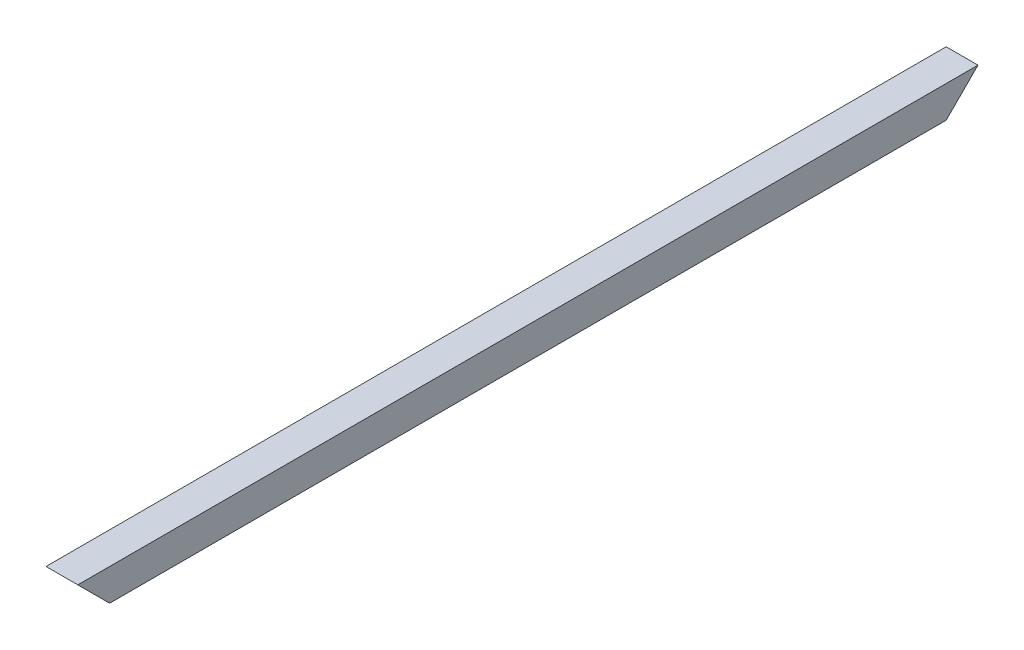
ISO-10303-21;
HEADER;
FILE_DESCRIPTION(('STEP AP214'),'2;1');
FILE_NAME('part.step','',(''),(''),'','','');
FILE_SCHEMA(('AUTOMOTIVE_DESIGN { 1 0 10303 214 1 1 1 1 }'));
ENDSEC;
DATA;
#1=APPLICATION_CONTEXT('core data for automotive mechanical design processes');
#2=APPLICATION_PROTOCOL_DEFINITION('international standard','automotive_design',2000,#1);
#3=PRODUCT_CONTEXT('',#1,'mechanical');
#4=PRODUCT('Part','Part','',(#3));
#5=PRODUCT_RELATED_PRODUCT_CATEGORY('part','',(#4));
#6=PRODUCT_DEFINITION_FORMATION('','',#4);
#7=PRODUCT_DEFINITION_CONTEXT('part definition',#1,'design');
#8=PRODUCT_DEFINITION('design','',#6,#7);
#9=PRODUCT_DEFINITION_SHAPE('','',#8);
#10=(LENGTH_UNIT() NAMED_UNIT(*) SI_UNIT(.MILLI.,.METRE.));
#11=(NAMED_UNIT(*) PLANE_ANGLE_UNIT() SI_UNIT($,.RADIAN.));
#12=(NAMED_UNIT(*) SI_UNIT($,.STERADIAN.) SOLID_ANGLE_UNIT());
#13=UNCERTAINTY_MEASURE_WITH_UNIT(LENGTH_MEASURE(1.E-05),#10,'distance_accuracy_value','');
#14=(GEOMETRIC_REPRESENTATION_CONTEXT(3) GLOBAL_UNCERTAINTY_ASSIGNED_CONTEXT((#13)) GLOBAL_UNIT_ASSIGNED_CONTEXT((#10,
#11,#12)) REPRESENTATION_CONTEXT('',''));
#15=CARTESIAN_POINT('',(0.,0.,0.));
#16=DIRECTION('',(0.,0.,1.));
#17=DIRECTION('',(1.,0.,0.));
#18=AXIS2_PLACEMENT_3D('',#15,#16,#17);
#19=CARTESIAN_POINT('',(-23.,-23.,1414.3));
#20=DIRECTION('',(0.,1.,0.));
#21=DIRECTION('',(0.,0.,1.));
#22=AXIS2_PLACEMENT_3D('',#19,#20,#21);
#23=PLANE('',#22);
#24=DIRECTION('',(-1.,0.,0.));
#25=VECTOR('',#24,1.);
#26=CARTESIAN_POINT('',(-23.,-23.,1366.3));
#27=LINE('',#26,#25);
#28=CARTESIAN_POINT('',(23.,-23.,1366.3));
#29=VERTEX_POINT('',#28);
#30=CARTESIAN_POINT('',(-23.,-23.,1366.3));
#31=VERTEX_POINT('',#30);
#32=EDGE_CURVE('E11',#29,#31,#27,.T.);
#33=ORIENTED_EDGE('',*,*,#32,.F.);
#34=DIRECTION('',(0.,0.,-1.));
#35=VECTOR('',#34,1.);
#36=CARTESIAN_POINT('',(23.,-23.,1414.3));
#37=LINE('',#36,#35);
#38=CARTESIAN_POINT('',(23.,-23.,48.));
#39=VERTEX_POINT('',#38);
#40=EDGE_CURVE('E153',#29,#39,#37,.T.);
#41=ORIENTED_EDGE('',*,*,#40,.T.);
#42=DIRECTION('',(1.,0.,0.));
#43=VECTOR('',#42,1.);
#44=CARTESIAN_POINT('',(-23.,-23.,48.));
#45=LINE('',#44,#43);
#46=CARTESIAN_POINT('',(-23.,-23.,48.));
#47=VERTEX_POINT('',#46);
#48=EDGE_CURVE('E48',#47,#39,#45,.T.);
#49=ORIENTED_EDGE('',*,*,#48,.F.);
#50=DIRECTION('',(0.,0.,-1.));
#51=VECTOR('',#50,1.);
#52=CARTESIAN_POINT('',(-23.,-23.,1414.3));
#53=LINE('',#52,#51);
#54=EDGE_CURVE('E162',#31,#47,#53,.T.);
#55=ORIENTED_EDGE('',*,*,#54,.F.);
#56=EDGE_LOOP('',(#33,#41,#49,#55));
#57=FACE_BOUND('',#56,.T.);
#58=ADVANCED_FACE('F39',(#57),#23,.T.);
#59=CARTESIAN_POINT('',(-23.,-23.,1414.3));
#60=DIRECTION('',(1.,0.,0.));
#61=DIRECTION('',(0.,0.,-1.));
#62=AXIS2_PLACEMENT_3D('',#59,#60,#61);
#63=PLANE('',#62);
#64=DIRECTION('',(0.,0.707106781186547,0.707106781186548));
#65=VECTOR('',#64,1.);
#66=CARTESIAN_POINT('',(-23.,1.00000000000003,1390.3));
#67=LINE('',#66,#65);
#68=CARTESIAN_POINT('',(-23.,23.,1412.3));
#69=VERTEX_POINT('',#68);
#70=EDGE_CURVE('E157',#31,#69,#67,.T.);
#71=ORIENTED_EDGE('',*,*,#70,.F.);
#72=ORIENTED_EDGE('',*,*,#54,.T.);
#73=DIRECTION('',(0.,-0.707106781186548,0.707106781186548));
#74=VECTOR('',#73,1.);
#75=CARTESIAN_POINT('',(-23.,-706.15,731.15));
#76=LINE('',#75,#74);
#77=CARTESIAN_POINT('',(-23.,22.9999999999999,2.00000000000011));
#78=VERTEX_POINT('',#77);
#79=EDGE_CURVE('E143',#78,#47,#76,.T.);
#80=ORIENTED_EDGE('',*,*,#79,.F.);
#81=DIRECTION('',(0.,0.,-1.));
#82=VECTOR('',#81,1.);
#83=CARTESIAN_POINT('',(-23.,23.,1414.3));
#84=LINE('',#83,#82);
#85=EDGE_CURVE('E167',#69,#78,#84,.T.);
#86=ORIENTED_EDGE('',*,*,#85,.F.);
#87=EDGE_LOOP('',(#71,#72,#80,#86));
#88=FACE_BOUND('',#87,.T.);
#89=ADVANCED_FACE('F208',(#88),#63,.T.);
#90=CARTESIAN_POINT('',(-23.,23.,1414.3));
#91=DIRECTION('',(0.,-1.,0.));
#92=DIRECTION('',(1.,0.,0.));
#93=AXIS2_PLACEMENT_3D('',#90,#91,#92);
#94=PLANE('',#93);
#95=DIRECTION('',(1.,0.,0.));
#96=VECTOR('',#95,1.);
#97=CARTESIAN_POINT('',(-23.,23.,1412.3));
#98=LINE('',#97,#96);
#99=CARTESIAN_POINT('',(23.,23.,1412.3));
#100=VERTEX_POINT('',#99);
#101=EDGE_CURVE('E169',#69,#100,#98,.T.);
#102=ORIENTED_EDGE('',*,*,#101,.F.);
#103=ORIENTED_EDGE('',*,*,#85,.T.);
#104=DIRECTION('',(-1.,0.,0.));
#105=VECTOR('',#104,1.);
#106=CARTESIAN_POINT('',(-23.0000000000001,23.,2.));
#107=LINE('',#106,#105);
#108=CARTESIAN_POINT('',(23.,23.,2.));
#109=VERTEX_POINT('',#108);
#110=EDGE_CURVE('E158',#109,#78,#107,.T.);
#111=ORIENTED_EDGE('',*,*,#110,.F.);
#112=DIRECTION('',(0.,0.,-1.));
#113=VECTOR('',#112,1.);
#114=CARTESIAN_POINT('',(23.,23.,1414.3));
#115=LINE('',#114,#113);
#116=EDGE_CURVE('E155',#100,#109,#115,.T.);
#117=ORIENTED_EDGE('',*,*,#116,.F.);
#118=EDGE_LOOP('',(#102,#103,#111,#117));
#119=FACE_BOUND('',#118,.T.);
#120=ADVANCED_FACE('F206',(#119),#94,.T.);
#121=CARTESIAN_POINT('',(23.,-23.,1414.3));
#122=DIRECTION('',(-1.,0.,0.));
#123=DIRECTION('',(0.,-1.,0.));
#124=AXIS2_PLACEMENT_3D('',#121,#122,#123);
#125=PLANE('',#124);
#126=DIRECTION('',(0.,-0.707106781186547,-0.707106781186548));
#127=VECTOR('',#126,1.);
#128=CARTESIAN_POINT('',(23.,1.00000000000003,1390.3));
#129=LINE('',#128,#127);
#130=EDGE_CURVE('E163',#100,#29,#129,.T.);
#131=ORIENTED_EDGE('',*,*,#130,.F.);
#132=ORIENTED_EDGE('',*,*,#116,.T.);
#133=DIRECTION('',(0.,0.707106781186548,-0.707106781186548));
#134=VECTOR('',#133,1.);
#135=CARTESIAN_POINT('',(23.0000000000001,-706.15,731.15));
#136=LINE('',#135,#134);
#137=EDGE_CURVE('E140',#39,#109,#136,.T.);
#138=ORIENTED_EDGE('',*,*,#137,.F.);
#139=ORIENTED_EDGE('',*,*,#40,.F.);
#140=EDGE_LOOP('',(#131,#132,#138,#139));
#141=FACE_BOUND('',#140,.T.);
#142=ADVANCED_FACE('F152',(#141),#125,.T.);
#143=CARTESIAN_POINT('',(-25.,-25.,50.));
#144=DIRECTION('',(0.,0.707106781186547,0.707106781186547));
#145=DIRECTION('',(0.,-0.707106781186548,0.707106781186548));
#146=AXIS2_PLACEMENT_3D('',#143,#144,#145);
#147=PLANE('',#146);
#148=ORIENTED_EDGE('',*,*,#137,.T.);
#149=ORIENTED_EDGE('',*,*,#110,.T.);
#150=ORIENTED_EDGE('',*,*,#79,.T.);
#151=ORIENTED_EDGE('',*,*,#48,.T.);
#152=EDGE_LOOP('',(#148,#149,#150,#151));
#153=FACE_BOUND('',#152,.T.);
#154=DIRECTION('',(0.,-0.707106781186547,0.707106781186547));
#155=VECTOR('',#154,1.);
#156=CARTESIAN_POINT('',(25.,-25.,50.));
#157=LINE('',#156,#155);
#158=CARTESIAN_POINT('',(25.,25.,0.));
#159=VERTEX_POINT('',#158);
#160=CARTESIAN_POINT('',(25.,-25.,50.));
#161=VERTEX_POINT('',#160);
#162=EDGE_CURVE('E63',#159,#161,#157,.T.);
#163=ORIENTED_EDGE('',*,*,#162,.T.);
#164=DIRECTION('',(1.,0.,0.));
#165=VECTOR('',#164,1.);
#166=CARTESIAN_POINT('',(-25.,-25.,50.));
#167=LINE('',#166,#165);
#168=CARTESIAN_POINT('',(-25.,-25.,50.));
#169=VERTEX_POINT('',#168);
#170=EDGE_CURVE('E185',#169,#161,#167,.T.);
#171=ORIENTED_EDGE('',*,*,#170,.F.);
#172=DIRECTION('',(0.,-0.707106781186547,0.707106781186547));
#173=VECTOR('',#172,1.);
#174=CARTESIAN_POINT('',(-25.,-25.,50.));
#175=LINE('',#174,#173);
#176=CARTESIAN_POINT('',(-25.,25.,0.));
#177=VERTEX_POINT('',#176);
#178=EDGE_CURVE('E187',#177,#169,#175,.T.);
#179=ORIENTED_EDGE('',*,*,#178,.F.);
#180=DIRECTION('',(-1.,0.,0.));
#181=VECTOR('',#180,1.);
#182=CARTESIAN_POINT('',(-25.,25.,0.));
#183=LINE('',#182,#181);
#184=EDGE_CURVE('E112',#159,#177,#183,.T.);
#185=ORIENTED_EDGE('',*,*,#184,.F.);
#186=EDGE_LOOP('',(#163,#171,#179,#185));
#187=FACE_BOUND('',#186,.T.);
#188=ADVANCED_FACE('F139',(#153,#187),#147,.F.);
#189=CARTESIAN_POINT('',(-25.,-25.,1364.3));
#190=DIRECTION('',(0.,0.707106781186548,-0.707106781186547));
#191=DIRECTION('',(0.,0.707106781186547,0.707106781186548));
#192=AXIS2_PLACEMENT_3D('',#189,#190,#191);
#193=PLANE('',#192);
#194=ORIENTED_EDGE('',*,*,#130,.T.);
#195=ORIENTED_EDGE('',*,*,#32,.T.);
#196=ORIENTED_EDGE('',*,*,#70,.T.);
#197=ORIENTED_EDGE('',*,*,#101,.T.);
#198=EDGE_LOOP('',(#194,#195,#196,#197));
#199=FACE_BOUND('',#198,.T.);
#200=DIRECTION('',(0.,0.707106781186547,0.707106781186548));
#201=VECTOR('',#200,1.);
#202=CARTESIAN_POINT('',(25.,-25.,1364.3));
#203=LINE('',#202,#201);
#204=CARTESIAN_POINT('',(25.,-25.,1364.3));
#205=VERTEX_POINT('',#204);
#206=CARTESIAN_POINT('',(25.,25.,1414.3));
#207=VERTEX_POINT('',#206);
#208=EDGE_CURVE('E105',#205,#207,#203,.T.);
#209=ORIENTED_EDGE('',*,*,#208,.T.);
#210=DIRECTION('',(-1.,0.,0.));
#211=VECTOR('',#210,1.);
#212=CARTESIAN_POINT('',(-25.,25.,1414.3));
#213=LINE('',#212,#211);
#214=CARTESIAN_POINT('',(-25.,25.,1414.3));
#215=VERTEX_POINT('',#214);
#216=EDGE_CURVE('E102',#207,#215,#213,.T.);
#217=ORIENTED_EDGE('',*,*,#216,.T.);
#218=DIRECTION('',(0.,0.707106781186547,0.707106781186548));
#219=VECTOR('',#218,1.);
#220=CARTESIAN_POINT('',(-25.,-25.,1364.3));
#221=LINE('',#220,#219);
#222=CARTESIAN_POINT('',(-25.,-25.,1364.3));
#223=VERTEX_POINT('',#222);
#224=EDGE_CURVE('E55',#223,#215,#221,.T.);
#225=ORIENTED_EDGE('',*,*,#224,.F.);
#226=DIRECTION('',(1.,0.,0.));
#227=VECTOR('',#226,1.);
#228=CARTESIAN_POINT('',(-25.,-25.,1364.3));
#229=LINE('',#228,#227);
#230=EDGE_CURVE('E123',#223,#205,#229,.T.);
#231=ORIENTED_EDGE('',*,*,#230,.T.);
#232=EDGE_LOOP('',(#209,#217,#225,#231));
#233=FACE_BOUND('',#232,.T.);
#234=ADVANCED_FACE('F103',(#199,#233),#193,.F.);
#235=CARTESIAN_POINT('',(25.,-25.,1414.3));
#236=DIRECTION('',(-1.,0.,0.));
#237=DIRECTION('',(0.,0.,1.));
#238=AXIS2_PLACEMENT_3D('',#235,#236,#237);
#239=PLANE('',#238);
#240=DIRECTION('',(0.,0.,-1.));
#241=VECTOR('',#240,1.);
#242=CARTESIAN_POINT('',(25.,25.,1414.3));
#243=LINE('',#242,#241);
#244=EDGE_CURVE('E128',#207,#159,#243,.T.);
#245=ORIENTED_EDGE('',*,*,#244,.F.);
#246=ORIENTED_EDGE('',*,*,#208,.F.);
#247=DIRECTION('',(0.,0.,-1.));
#248=VECTOR('',#247,1.);
#249=CARTESIAN_POINT('',(25.,-25.,1414.3));
#250=LINE('',#249,#248);
#251=EDGE_CURVE('E111',#205,#161,#250,.T.);
#252=ORIENTED_EDGE('',*,*,#251,.T.);
#253=ORIENTED_EDGE('',*,*,#162,.F.);
#254=EDGE_LOOP('',(#245,#246,#252,#253));
#255=FACE_BOUND('',#254,.T.);
#256=ADVANCED_FACE('F41',(#255),#239,.F.);
#257=CARTESIAN_POINT('',(-25.,25.,1414.3));
#258=DIRECTION('',(0.,-1.,0.));
#259=DIRECTION('',(0.,0.,-1.));
#260=AXIS2_PLACEMENT_3D('',#257,#258,#259);
#261=PLANE('',#260);
#262=ORIENTED_EDGE('',*,*,#184,.T.);
#263=DIRECTION('',(0.,0.,-1.));
#264=VECTOR('',#263,1.);
#265=CARTESIAN_POINT('',(-25.,25.,1414.3));
#266=LINE('',#265,#264);
#267=EDGE_CURVE('E119',#215,#177,#266,.T.);
#268=ORIENTED_EDGE('',*,*,#267,.F.);
#269=ORIENTED_EDGE('',*,*,#216,.F.);
#270=ORIENTED_EDGE('',*,*,#244,.T.);
#271=EDGE_LOOP('',(#262,#268,#269,#270));
#272=FACE_BOUND('',#271,.T.);
#273=ADVANCED_FACE('F126',(#272),#261,.F.);
#274=CARTESIAN_POINT('',(-25.,-25.,1414.3));
#275=DIRECTION('',(1.,0.,0.));
#276=DIRECTION('',(0.,0.,-1.));
#277=AXIS2_PLACEMENT_3D('',#274,#275,#276);
#278=PLANE('',#277);
#279=DIRECTION('',(0.,0.,-1.));
#280=VECTOR('',#279,1.);
#281=CARTESIAN_POINT('',(-25.,-25.,1414.3));
#282=LINE('',#281,#280);
#283=EDGE_CURVE('E121',#223,#169,#282,.T.);
#284=ORIENTED_EDGE('',*,*,#283,.F.);
#285=ORIENTED_EDGE('',*,*,#224,.T.);
#286=ORIENTED_EDGE('',*,*,#267,.T.);
#287=ORIENTED_EDGE('',*,*,#178,.T.);
#288=EDGE_LOOP('',(#284,#285,#286,#287));
#289=FACE_BOUND('',#288,.T.);
#290=ADVANCED_FACE('F117',(#289),#278,.F.);
#291=CARTESIAN_POINT('',(-25.,-25.,1414.3));
#292=DIRECTION('',(0.,1.,0.));
#293=DIRECTION('',(0.,0.,1.));
#294=AXIS2_PLACEMENT_3D('',#291,#292,#293);
#295=PLANE('',#294);
#296=ORIENTED_EDGE('',*,*,#251,.F.);
#297=ORIENTED_EDGE('',*,*,#230,.F.);
#298=ORIENTED_EDGE('',*,*,#283,.T.);
#299=ORIENTED_EDGE('',*,*,#170,.T.);
#300=EDGE_LOOP('',(#296,#297,#298,#299));
#301=FACE_BOUND('',#300,.T.);
#302=ADVANCED_FACE('F184',(#301),#295,.F.);
#303=CLOSED_SHELL('',(#58,#89,#120,#142,#188,#234,#256,#273,#290,#302));
#304=MANIFOLD_SOLID_BREP('B2',#303);
#305=ADVANCED_BREP_SHAPE_REPRESENTATION('',(#18,#304),#14);
#306=SHAPE_DEFINITION_REPRESENTATION(#9,#305);
ENDSEC;
END-ISO-10303-21;
